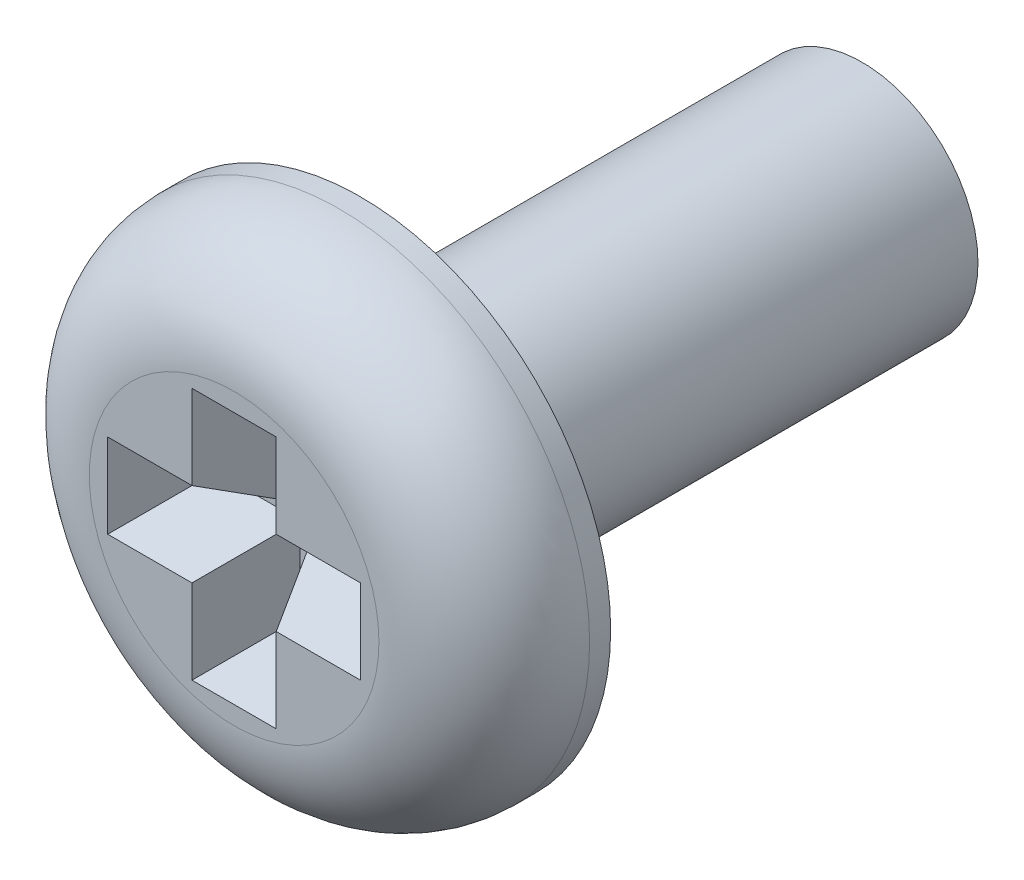
ISO-10303-21;
HEADER;
FILE_DESCRIPTION(('STEP AP214'),'2;1');
FILE_NAME('part.step','',(''),(''),'','','');
FILE_SCHEMA(('AUTOMOTIVE_DESIGN { 1 0 10303 214 1 1 1 1 }'));
ENDSEC;
DATA;
#1=APPLICATION_CONTEXT('core data for automotive mechanical design processes');
#2=APPLICATION_PROTOCOL_DEFINITION('international standard','automotive_design',2000,#1);
#3=PRODUCT_CONTEXT('',#1,'mechanical');
#4=PRODUCT('Part','Part','',(#3));
#5=PRODUCT_RELATED_PRODUCT_CATEGORY('part','',(#4));
#6=PRODUCT_DEFINITION_FORMATION('','',#4);
#7=PRODUCT_DEFINITION_CONTEXT('part definition',#1,'design');
#8=PRODUCT_DEFINITION('design','',#6,#7);
#9=PRODUCT_DEFINITION_SHAPE('','',#8);
#10=(LENGTH_UNIT() NAMED_UNIT(*) SI_UNIT(.MILLI.,.METRE.));
#11=(NAMED_UNIT(*) PLANE_ANGLE_UNIT() SI_UNIT($,.RADIAN.));
#12=(NAMED_UNIT(*) SI_UNIT($,.STERADIAN.) SOLID_ANGLE_UNIT());
#13=UNCERTAINTY_MEASURE_WITH_UNIT(LENGTH_MEASURE(1.E-05),#10,'distance_accuracy_value','');
#14=(GEOMETRIC_REPRESENTATION_CONTEXT(3) GLOBAL_UNCERTAINTY_ASSIGNED_CONTEXT((#13)) GLOBAL_UNIT_ASSIGNED_CONTEXT((#10,
#11,#12)) REPRESENTATION_CONTEXT('',''));
#15=CARTESIAN_POINT('',(0.,0.,0.));
#16=DIRECTION('',(0.,0.,1.));
#17=DIRECTION('',(1.,0.,0.));
#18=AXIS2_PLACEMENT_3D('',#15,#16,#17);
#19=CARTESIAN_POINT('',(0.,0.,0.));
#20=DIRECTION('',(0.,0.,1.));
#21=DIRECTION('',(1.,0.,0.));
#22=AXIS2_PLACEMENT_3D('',#19,#20,#21);
#23=PLANE('',#22);
#24=CARTESIAN_POINT('',(0.,0.,0.));
#25=DIRECTION('',(0.,0.,1.));
#26=DIRECTION('',(1.,0.,0.));
#27=AXIS2_PLACEMENT_3D('',#24,#25,#26);
#28=CIRCLE('',#27,2.375);
#29=CARTESIAN_POINT('',(2.375,0.,0.));
#30=VERTEX_POINT('',#29);
#31=EDGE_CURVE('E174',#30,#30,#28,.T.);
#32=ORIENTED_EDGE('',*,*,#31,.F.);
#33=EDGE_LOOP('',(#32));
#34=FACE_BOUND('',#33,.T.);
#35=CARTESIAN_POINT('',(0.,0.,0.));
#36=DIRECTION('',(0.,0.,1.));
#37=DIRECTION('',(1.,0.,0.));
#38=AXIS2_PLACEMENT_3D('',#35,#36,#37);
#39=CIRCLE('',#38,1.1);
#40=CARTESIAN_POINT('',(1.1,0.,0.));
#41=VERTEX_POINT('',#40);
#42=EDGE_CURVE('E11',#41,#41,#39,.F.);
#43=ORIENTED_EDGE('',*,*,#42,.F.);
#44=EDGE_LOOP('',(#43));
#45=FACE_BOUND('',#44,.T.);
#46=ADVANCED_FACE('F30',(#34,#45),#23,.F.);
#47=CARTESIAN_POINT('',(0.,0.,1.2));
#48=DIRECTION('',(0.,0.,-1.));
#49=DIRECTION('',(-1.,0.,0.));
#50=AXIS2_PLACEMENT_3D('',#47,#48,#49);
#51=CYLINDRICAL_SURFACE('',#50,2.375);
#52=CARTESIAN_POINT('',(0.,0.,0.2));
#53=DIRECTION('',(0.,0.,1.));
#54=DIRECTION('',(1.,0.,0.));
#55=AXIS2_PLACEMENT_3D('',#52,#53,#54);
#56=CIRCLE('',#55,2.375);
#57=CARTESIAN_POINT('',(2.375,0.,0.2));
#58=VERTEX_POINT('',#57);
#59=EDGE_CURVE('E38',#58,#58,#56,.F.);
#60=ORIENTED_EDGE('',*,*,#59,.T.);
#61=EDGE_LOOP('',(#60));
#62=FACE_BOUND('',#61,.T.);
#63=ORIENTED_EDGE('',*,*,#31,.T.);
#64=EDGE_LOOP('',(#63));
#65=FACE_BOUND('',#64,.T.);
#66=ADVANCED_FACE('F32',(#62,#65),#51,.T.);
#67=CARTESIAN_POINT('',(0.,0.,1.2));
#68=DIRECTION('',(0.,0.,1.));
#69=DIRECTION('',(1.,0.,0.));
#70=AXIS2_PLACEMENT_3D('',#67,#68,#69);
#71=PLANE('',#70);
#72=DIRECTION('',(0.,1.,0.));
#73=VECTOR('',#72,1.);
#74=CARTESIAN_POINT('',(1.2,0.4,1.2));
#75=LINE('',#74,#73);
#76=CARTESIAN_POINT('',(1.2,-0.4,1.2));
#77=VERTEX_POINT('',#76);
#78=CARTESIAN_POINT('',(1.2,0.4,1.2));
#79=VERTEX_POINT('',#78);
#80=EDGE_CURVE('E45',#77,#79,#75,.T.);
#81=ORIENTED_EDGE('',*,*,#80,.F.);
#82=DIRECTION('',(1.,0.,0.));
#83=VECTOR('',#82,1.);
#84=CARTESIAN_POINT('',(1.2,-0.4,1.2));
#85=LINE('',#84,#83);
#86=CARTESIAN_POINT('',(0.4,-0.4,1.2));
#87=VERTEX_POINT('',#86);
#88=EDGE_CURVE('E170',#87,#77,#85,.T.);
#89=ORIENTED_EDGE('',*,*,#88,.F.);
#90=DIRECTION('',(0.,1.,0.));
#91=VECTOR('',#90,1.);
#92=CARTESIAN_POINT('',(0.4,-0.4,1.2));
#93=LINE('',#92,#91);
#94=CARTESIAN_POINT('',(0.4,-1.2,1.2));
#95=VERTEX_POINT('',#94);
#96=EDGE_CURVE('E168',#95,#87,#93,.T.);
#97=ORIENTED_EDGE('',*,*,#96,.F.);
#98=DIRECTION('',(1.,0.,0.));
#99=VECTOR('',#98,1.);
#100=CARTESIAN_POINT('',(-0.4,-1.2,1.2));
#101=LINE('',#100,#99);
#102=CARTESIAN_POINT('',(-0.4,-1.2,1.2));
#103=VERTEX_POINT('',#102);
#104=EDGE_CURVE('E165',#103,#95,#101,.T.);
#105=ORIENTED_EDGE('',*,*,#104,.F.);
#106=DIRECTION('',(0.,-1.,0.));
#107=VECTOR('',#106,1.);
#108=CARTESIAN_POINT('',(-0.4,-0.4,1.2));
#109=LINE('',#108,#107);
#110=CARTESIAN_POINT('',(-0.4,-0.4,1.2));
#111=VERTEX_POINT('',#110);
#112=EDGE_CURVE('E162',#111,#103,#109,.T.);
#113=ORIENTED_EDGE('',*,*,#112,.F.);
#114=DIRECTION('',(1.,0.,0.));
#115=VECTOR('',#114,1.);
#116=CARTESIAN_POINT('',(-0.4,-0.4,1.2));
#117=LINE('',#116,#115);
#118=CARTESIAN_POINT('',(-1.2,-0.4,1.2));
#119=VERTEX_POINT('',#118);
#120=EDGE_CURVE('E159',#119,#111,#117,.T.);
#121=ORIENTED_EDGE('',*,*,#120,.F.);
#122=DIRECTION('',(0.,-1.,0.));
#123=VECTOR('',#122,1.);
#124=CARTESIAN_POINT('',(-1.2,0.4,1.2));
#125=LINE('',#124,#123);
#126=CARTESIAN_POINT('',(-1.2,0.4,1.2));
#127=VERTEX_POINT('',#126);
#128=EDGE_CURVE('E156',#127,#119,#125,.T.);
#129=ORIENTED_EDGE('',*,*,#128,.F.);
#130=DIRECTION('',(-1.,0.,0.));
#131=VECTOR('',#130,1.);
#132=CARTESIAN_POINT('',(-0.4,0.4,1.2));
#133=LINE('',#132,#131);
#134=CARTESIAN_POINT('',(-0.4,0.4,1.2));
#135=VERTEX_POINT('',#134);
#136=EDGE_CURVE('E153',#135,#127,#133,.T.);
#137=ORIENTED_EDGE('',*,*,#136,.F.);
#138=DIRECTION('',(0.,-1.,0.));
#139=VECTOR('',#138,1.);
#140=CARTESIAN_POINT('',(-0.4,1.2,1.2));
#141=LINE('',#140,#139);
#142=CARTESIAN_POINT('',(-0.4,1.2,1.2));
#143=VERTEX_POINT('',#142);
#144=EDGE_CURVE('E147',#143,#135,#141,.T.);
#145=ORIENTED_EDGE('',*,*,#144,.F.);
#146=DIRECTION('',(-1.,0.,0.));
#147=VECTOR('',#146,1.);
#148=CARTESIAN_POINT('',(-0.4,1.2,1.2));
#149=LINE('',#148,#147);
#150=CARTESIAN_POINT('',(0.4,1.2,1.2));
#151=VERTEX_POINT('',#150);
#152=EDGE_CURVE('E145',#151,#143,#149,.T.);
#153=ORIENTED_EDGE('',*,*,#152,.F.);
#154=DIRECTION('',(0.,1.,0.));
#155=VECTOR('',#154,1.);
#156=CARTESIAN_POINT('',(0.4,1.2,1.2));
#157=LINE('',#156,#155);
#158=CARTESIAN_POINT('',(0.4,0.4,1.2));
#159=VERTEX_POINT('',#158);
#160=EDGE_CURVE('E128',#159,#151,#157,.T.);
#161=ORIENTED_EDGE('',*,*,#160,.F.);
#162=DIRECTION('',(-1.,0.,0.));
#163=VECTOR('',#162,1.);
#164=CARTESIAN_POINT('',(1.2,0.4,1.2));
#165=LINE('',#164,#163);
#166=EDGE_CURVE('E137',#79,#159,#165,.T.);
#167=ORIENTED_EDGE('',*,*,#166,.F.);
#168=EDGE_LOOP('',(#81,#89,#97,#105,#113,#121,#129,#137,#145,#153,#161,#167));
#169=FACE_BOUND('',#168,.T.);
#170=CARTESIAN_POINT('',(0.,0.,1.2));
#171=DIRECTION('',(0.,0.,1.));
#172=DIRECTION('',(1.,0.,0.));
#173=AXIS2_PLACEMENT_3D('',#170,#171,#172);
#174=CIRCLE('',#173,1.375);
#175=CARTESIAN_POINT('',(1.375,0.,1.2));
#176=VERTEX_POINT('',#175);
#177=EDGE_CURVE('E226',#176,#176,#174,.T.);
#178=ORIENTED_EDGE('',*,*,#177,.T.);
#179=EDGE_LOOP('',(#178));
#180=FACE_BOUND('',#179,.T.);
#181=ADVANCED_FACE('F141',(#169,#180),#71,.T.);
#182=CARTESIAN_POINT('',(0.,0.,0.2));
#183=DIRECTION('',(0.,0.,1.));
#184=DIRECTION('',(1.,0.,0.));
#185=AXIS2_PLACEMENT_3D('',#182,#183,#184);
#186=TOROIDAL_SURFACE('',#185,1.375,1.);
#187=ORIENTED_EDGE('',*,*,#59,.F.);
#188=EDGE_LOOP('',(#187));
#189=FACE_BOUND('',#188,.T.);
#190=ORIENTED_EDGE('',*,*,#177,.F.);
#191=EDGE_LOOP('',(#190));
#192=FACE_BOUND('',#191,.T.);
#193=ADVANCED_FACE('F233',(#189,#192),#186,.T.);
#194=CARTESIAN_POINT('',(1.2,0.4,1.2));
#195=DIRECTION('',(0.906307787036649,0.,-0.4226182617407));
#196=DIRECTION('',(-0.4226182617407,0.,-0.90630778703665));
#197=AXIS2_PLACEMENT_3D('',#194,#195,#196);
#198=PLANE('',#197);
#199=ORIENTED_EDGE('',*,*,#80,.T.);
#200=DIRECTION('',(0.389281620635026,0.389281620635026,0.834817129478987));
#201=VECTOR('',#200,1.);
#202=CARTESIAN_POINT('',(1.2,0.4,1.2));
#203=LINE('',#202,#201);
#204=CARTESIAN_POINT('',(0.8735846392915,0.0735846392915003,0.5));
#205=VERTEX_POINT('',#204);
#206=EDGE_CURVE('E88',#205,#79,#203,.T.);
#207=ORIENTED_EDGE('',*,*,#206,.F.);
#208=DIRECTION('',(0.,1.,0.));
#209=VECTOR('',#208,1.);
#210=CARTESIAN_POINT('',(0.8735846392915,-1.2,0.5));
#211=LINE('',#210,#209);
#212=CARTESIAN_POINT('',(0.8735846392915,-0.0735846392915001,0.5));
#213=VERTEX_POINT('',#212);
#214=EDGE_CURVE('E172',#213,#205,#211,.T.);
#215=ORIENTED_EDGE('',*,*,#214,.F.);
#216=DIRECTION('',(0.389281620635026,-0.389281620635026,0.834817129478987));
#217=VECTOR('',#216,1.);
#218=CARTESIAN_POINT('',(1.2,-0.4,1.2));
#219=LINE('',#218,#217);
#220=EDGE_CURVE('E53',#213,#77,#219,.T.);
#221=ORIENTED_EDGE('',*,*,#220,.T.);
#222=EDGE_LOOP('',(#199,#207,#215,#221));
#223=FACE_BOUND('',#222,.T.);
#224=ADVANCED_FACE('F236',(#223),#198,.F.);
#225=CARTESIAN_POINT('',(1.2,-0.4,1.2));
#226=DIRECTION('',(0.,-0.906307787036649,-0.4226182617407));
#227=DIRECTION('',(0.,0.4226182617407,-0.90630778703665));
#228=AXIS2_PLACEMENT_3D('',#225,#226,#227);
#229=PLANE('',#228);
#230=ORIENTED_EDGE('',*,*,#88,.T.);
#231=ORIENTED_EDGE('',*,*,#220,.F.);
#232=DIRECTION('',(1.,0.,0.));
#233=VECTOR('',#232,1.);
#234=CARTESIAN_POINT('',(1.2,-0.0735846392915002,0.5));
#235=LINE('',#234,#233);
#236=CARTESIAN_POINT('',(0.0735846392915001,-0.0735846392915002,0.5));
#237=VERTEX_POINT('',#236);
#238=EDGE_CURVE('E175',#237,#213,#235,.T.);
#239=ORIENTED_EDGE('',*,*,#238,.F.);
#240=DIRECTION('',(0.389281620635026,-0.389281620635026,0.834817129478987));
#241=VECTOR('',#240,1.);
#242=CARTESIAN_POINT('',(0.521232144131386,-0.521232144131386,1.45998317207797));
#243=LINE('',#242,#241);
#244=EDGE_CURVE('E93',#237,#87,#243,.T.);
#245=ORIENTED_EDGE('',*,*,#244,.T.);
#246=EDGE_LOOP('',(#230,#231,#239,#245));
#247=FACE_BOUND('',#246,.T.);
#248=ADVANCED_FACE('F251',(#247),#229,.F.);
#249=CARTESIAN_POINT('',(0.4,-0.4,1.2));
#250=DIRECTION('',(0.906307787036649,0.,-0.4226182617407));
#251=DIRECTION('',(-0.4226182617407,0.,-0.90630778703665));
#252=AXIS2_PLACEMENT_3D('',#249,#250,#251);
#253=PLANE('',#252);
#254=ORIENTED_EDGE('',*,*,#96,.T.);
#255=ORIENTED_EDGE('',*,*,#244,.F.);
#256=DIRECTION('',(0.,1.,0.));
#257=VECTOR('',#256,1.);
#258=CARTESIAN_POINT('',(0.0735846392915004,-1.2,0.5));
#259=LINE('',#258,#257);
#260=CARTESIAN_POINT('',(0.0735846392915003,-0.8735846392915,0.5));
#261=VERTEX_POINT('',#260);
#262=EDGE_CURVE('E198',#261,#237,#259,.T.);
#263=ORIENTED_EDGE('',*,*,#262,.F.);
#264=DIRECTION('',(0.389281620635026,-0.389281620635026,0.834817129478987));
#265=VECTOR('',#264,1.);
#266=CARTESIAN_POINT('',(0.278767855868615,-1.07876785586861,0.940016827922032));
#267=LINE('',#266,#265);
#268=EDGE_CURVE('E190',#261,#95,#267,.T.);
#269=ORIENTED_EDGE('',*,*,#268,.T.);
#270=EDGE_LOOP('',(#254,#255,#263,#269));
#271=FACE_BOUND('',#270,.T.);
#272=ADVANCED_FACE('F254',(#271),#253,.F.);
#273=CARTESIAN_POINT('',(-0.4,-1.2,1.2));
#274=DIRECTION('',(0.,-0.90630778703665,-0.4226182617407));
#275=DIRECTION('',(0.,0.4226182617407,-0.90630778703665));
#276=AXIS2_PLACEMENT_3D('',#273,#274,#275);
#277=PLANE('',#276);
#278=ORIENTED_EDGE('',*,*,#104,.T.);
#279=ORIENTED_EDGE('',*,*,#268,.F.);
#280=DIRECTION('',(1.,0.,0.));
#281=VECTOR('',#280,1.);
#282=CARTESIAN_POINT('',(1.2,-0.8735846392915,0.5));
#283=LINE('',#282,#281);
#284=CARTESIAN_POINT('',(-0.0735846392915001,-0.8735846392915,0.5));
#285=VERTEX_POINT('',#284);
#286=EDGE_CURVE('E201',#285,#261,#283,.T.);
#287=ORIENTED_EDGE('',*,*,#286,.F.);
#288=DIRECTION('',(-0.389281620635026,-0.389281620635026,0.834817129478987));
#289=VECTOR('',#288,1.);
#290=CARTESIAN_POINT('',(-0.278767855868614,-1.07876785586861,0.940016827922032));
#291=LINE('',#290,#289);
#292=EDGE_CURVE('E188',#285,#103,#291,.T.);
#293=ORIENTED_EDGE('',*,*,#292,.T.);
#294=EDGE_LOOP('',(#278,#279,#287,#293));
#295=FACE_BOUND('',#294,.T.);
#296=ADVANCED_FACE('F257',(#295),#277,.F.);
#297=CARTESIAN_POINT('',(-0.4,-0.4,1.2));
#298=DIRECTION('',(-0.906307787036649,0.,-0.4226182617407));
#299=DIRECTION('',(-0.4226182617407,0.,0.90630778703665));
#300=AXIS2_PLACEMENT_3D('',#297,#298,#299);
#301=PLANE('',#300);
#302=ORIENTED_EDGE('',*,*,#112,.T.);
#303=ORIENTED_EDGE('',*,*,#292,.F.);
#304=DIRECTION('',(0.,-1.,0.));
#305=VECTOR('',#304,1.);
#306=CARTESIAN_POINT('',(-0.0735846392915002,-1.2,0.5));
#307=LINE('',#306,#305);
#308=CARTESIAN_POINT('',(-0.0735846392915002,-0.0735846392915001,0.5));
#309=VERTEX_POINT('',#308);
#310=EDGE_CURVE('E204',#309,#285,#307,.T.);
#311=ORIENTED_EDGE('',*,*,#310,.F.);
#312=DIRECTION('',(-0.389281620635026,-0.389281620635026,0.834817129478987));
#313=VECTOR('',#312,1.);
#314=CARTESIAN_POINT('',(-0.4,-0.4,1.2));
#315=LINE('',#314,#313);
#316=EDGE_CURVE('E186',#309,#111,#315,.T.);
#317=ORIENTED_EDGE('',*,*,#316,.T.);
#318=EDGE_LOOP('',(#302,#303,#311,#317));
#319=FACE_BOUND('',#318,.T.);
#320=ADVANCED_FACE('F261',(#319),#301,.F.);
#321=CARTESIAN_POINT('',(-0.4,-0.4,1.2));
#322=DIRECTION('',(0.,-0.90630778703665,-0.4226182617407));
#323=DIRECTION('',(0.,0.4226182617407,-0.90630778703665));
#324=AXIS2_PLACEMENT_3D('',#321,#322,#323);
#325=PLANE('',#324);
#326=ORIENTED_EDGE('',*,*,#120,.T.);
#327=ORIENTED_EDGE('',*,*,#316,.F.);
#328=DIRECTION('',(1.,0.,0.));
#329=VECTOR('',#328,1.);
#330=CARTESIAN_POINT('',(1.2,-0.0735846392914997,0.5));
#331=LINE('',#330,#329);
#332=CARTESIAN_POINT('',(-0.8735846392915,-0.0735846392915003,0.5));
#333=VERTEX_POINT('',#332);
#334=EDGE_CURVE('E207',#333,#309,#331,.T.);
#335=ORIENTED_EDGE('',*,*,#334,.F.);
#336=DIRECTION('',(-0.389281620635026,-0.389281620635026,0.834817129478987));
#337=VECTOR('',#336,1.);
#338=CARTESIAN_POINT('',(-1.07876785586861,-0.278767855868615,0.940016827922032));
#339=LINE('',#338,#337);
#340=EDGE_CURVE('E184',#333,#119,#339,.T.);
#341=ORIENTED_EDGE('',*,*,#340,.T.);
#342=EDGE_LOOP('',(#326,#327,#335,#341));
#343=FACE_BOUND('',#342,.T.);
#344=ADVANCED_FACE('F265',(#343),#325,.F.);
#345=CARTESIAN_POINT('',(-1.2,0.4,1.2));
#346=DIRECTION('',(-0.90630778703665,0.,-0.4226182617407));
#347=DIRECTION('',(-0.4226182617407,0.,0.90630778703665));
#348=AXIS2_PLACEMENT_3D('',#345,#346,#347);
#349=PLANE('',#348);
#350=ORIENTED_EDGE('',*,*,#128,.T.);
#351=ORIENTED_EDGE('',*,*,#340,.F.);
#352=DIRECTION('',(0.,-1.,0.));
#353=VECTOR('',#352,1.);
#354=CARTESIAN_POINT('',(-0.8735846392915,-1.2,0.5));
#355=LINE('',#354,#353);
#356=CARTESIAN_POINT('',(-0.8735846392915,0.0735846392915001,0.5));
#357=VERTEX_POINT('',#356);
#358=EDGE_CURVE('E210',#357,#333,#355,.T.);
#359=ORIENTED_EDGE('',*,*,#358,.F.);
#360=DIRECTION('',(-0.389281620635026,0.389281620635026,0.834817129478987));
#361=VECTOR('',#360,1.);
#362=CARTESIAN_POINT('',(-1.07876785586861,0.278767855868614,0.940016827922032));
#363=LINE('',#362,#361);
#364=EDGE_CURVE('E182',#357,#127,#363,.T.);
#365=ORIENTED_EDGE('',*,*,#364,.T.);
#366=EDGE_LOOP('',(#350,#351,#359,#365));
#367=FACE_BOUND('',#366,.T.);
#368=ADVANCED_FACE('F269',(#367),#349,.F.);
#369=CARTESIAN_POINT('',(-0.4,0.4,1.2));
#370=DIRECTION('',(0.,0.90630778703665,-0.4226182617407));
#371=DIRECTION('',(0.,0.4226182617407,0.90630778703665));
#372=AXIS2_PLACEMENT_3D('',#369,#370,#371);
#373=PLANE('',#372);
#374=ORIENTED_EDGE('',*,*,#136,.T.);
#375=ORIENTED_EDGE('',*,*,#364,.F.);
#376=DIRECTION('',(-1.,0.,0.));
#377=VECTOR('',#376,1.);
#378=CARTESIAN_POINT('',(1.2,0.0735846392915002,0.5));
#379=LINE('',#378,#377);
#380=CARTESIAN_POINT('',(-0.0735846392915003,0.0735846392915003,0.5));
#381=VERTEX_POINT('',#380);
#382=EDGE_CURVE('E213',#381,#357,#379,.T.);
#383=ORIENTED_EDGE('',*,*,#382,.F.);
#384=DIRECTION('',(-0.389281620635026,0.389281620635026,0.834817129478987));
#385=VECTOR('',#384,1.);
#386=CARTESIAN_POINT('',(-0.4,0.4,1.2));
#387=LINE('',#386,#385);
#388=EDGE_CURVE('E180',#381,#135,#387,.T.);
#389=ORIENTED_EDGE('',*,*,#388,.T.);
#390=EDGE_LOOP('',(#374,#375,#383,#389));
#391=FACE_BOUND('',#390,.T.);
#392=ADVANCED_FACE('F273',(#391),#373,.F.);
#393=CARTESIAN_POINT('',(-0.4,1.2,1.2));
#394=DIRECTION('',(-0.906307787036649,0.,-0.4226182617407));
#395=DIRECTION('',(-0.4226182617407,0.,0.90630778703665));
#396=AXIS2_PLACEMENT_3D('',#393,#394,#395);
#397=PLANE('',#396);
#398=ORIENTED_EDGE('',*,*,#144,.T.);
#399=ORIENTED_EDGE('',*,*,#388,.F.);
#400=DIRECTION('',(0.,-1.,0.));
#401=VECTOR('',#400,1.);
#402=CARTESIAN_POINT('',(-0.0735846392915002,-1.2,0.5));
#403=LINE('',#402,#401);
#404=CARTESIAN_POINT('',(-0.0735846392915003,0.8735846392915,0.5));
#405=VERTEX_POINT('',#404);
#406=EDGE_CURVE('E216',#405,#381,#403,.T.);
#407=ORIENTED_EDGE('',*,*,#406,.F.);
#408=DIRECTION('',(-0.389281620635026,0.389281620635026,0.834817129478987));
#409=VECTOR('',#408,1.);
#410=CARTESIAN_POINT('',(-0.4,1.2,1.2));
#411=LINE('',#410,#409);
#412=EDGE_CURVE('E178',#405,#143,#411,.T.);
#413=ORIENTED_EDGE('',*,*,#412,.T.);
#414=EDGE_LOOP('',(#398,#399,#407,#413));
#415=FACE_BOUND('',#414,.T.);
#416=ADVANCED_FACE('F277',(#415),#397,.F.);
#417=CARTESIAN_POINT('',(-0.4,1.2,1.2));
#418=DIRECTION('',(0.,0.90630778703665,-0.4226182617407));
#419=DIRECTION('',(0.,0.4226182617407,0.90630778703665));
#420=AXIS2_PLACEMENT_3D('',#417,#418,#419);
#421=PLANE('',#420);
#422=ORIENTED_EDGE('',*,*,#152,.T.);
#423=ORIENTED_EDGE('',*,*,#412,.F.);
#424=DIRECTION('',(-1.,0.,0.));
#425=VECTOR('',#424,1.);
#426=CARTESIAN_POINT('',(1.2,0.8735846392915,0.5));
#427=LINE('',#426,#425);
#428=CARTESIAN_POINT('',(0.0735846392915001,0.8735846392915,0.5));
#429=VERTEX_POINT('',#428);
#430=EDGE_CURVE('E219',#429,#405,#427,.T.);
#431=ORIENTED_EDGE('',*,*,#430,.F.);
#432=DIRECTION('',(0.389281620635026,0.389281620635026,0.834817129478987));
#433=VECTOR('',#432,1.);
#434=CARTESIAN_POINT('',(0.4,1.2,1.2));
#435=LINE('',#434,#433);
#436=EDGE_CURVE('E134',#429,#151,#435,.T.);
#437=ORIENTED_EDGE('',*,*,#436,.T.);
#438=EDGE_LOOP('',(#422,#423,#431,#437));
#439=FACE_BOUND('',#438,.T.);
#440=ADVANCED_FACE('F281',(#439),#421,.F.);
#441=CARTESIAN_POINT('',(0.4,1.2,1.2));
#442=DIRECTION('',(0.906307787036649,0.,-0.4226182617407));
#443=DIRECTION('',(-0.4226182617407,0.,-0.90630778703665));
#444=AXIS2_PLACEMENT_3D('',#441,#442,#443);
#445=PLANE('',#444);
#446=ORIENTED_EDGE('',*,*,#160,.T.);
#447=ORIENTED_EDGE('',*,*,#436,.F.);
#448=DIRECTION('',(0.,1.,0.));
#449=VECTOR('',#448,1.);
#450=CARTESIAN_POINT('',(0.0735846392915004,-1.2,0.5));
#451=LINE('',#450,#449);
#452=CARTESIAN_POINT('',(0.0735846392915002,0.0735846392915001,0.5));
#453=VERTEX_POINT('',#452);
#454=EDGE_CURVE('E131',#453,#429,#451,.T.);
#455=ORIENTED_EDGE('',*,*,#454,.F.);
#456=DIRECTION('',(0.389281620635026,0.389281620635026,0.834817129478987));
#457=VECTOR('',#456,1.);
#458=CARTESIAN_POINT('',(0.521232144131386,0.521232144131386,1.45998317207797));
#459=LINE('',#458,#457);
#460=EDGE_CURVE('E124',#453,#159,#459,.T.);
#461=ORIENTED_EDGE('',*,*,#460,.T.);
#462=EDGE_LOOP('',(#446,#447,#455,#461));
#463=FACE_BOUND('',#462,.T.);
#464=ADVANCED_FACE('F126',(#463),#445,.F.);
#465=CARTESIAN_POINT('',(1.2,0.4,1.2));
#466=DIRECTION('',(0.,0.906307787036649,-0.4226182617407));
#467=DIRECTION('',(0.,0.4226182617407,0.90630778703665));
#468=AXIS2_PLACEMENT_3D('',#465,#466,#467);
#469=PLANE('',#468);
#470=ORIENTED_EDGE('',*,*,#166,.T.);
#471=ORIENTED_EDGE('',*,*,#460,.F.);
#472=DIRECTION('',(-1.,0.,0.));
#473=VECTOR('',#472,1.);
#474=CARTESIAN_POINT('',(1.2,0.0735846392915004,0.5));
#475=LINE('',#474,#473);
#476=EDGE_CURVE('E195',#205,#453,#475,.T.);
#477=ORIENTED_EDGE('',*,*,#476,.F.);
#478=ORIENTED_EDGE('',*,*,#206,.T.);
#479=EDGE_LOOP('',(#470,#471,#477,#478));
#480=FACE_BOUND('',#479,.T.);
#481=ADVANCED_FACE('F138',(#480),#469,.F.);
#482=CARTESIAN_POINT('',(1.2,-1.2,0.5));
#483=DIRECTION('',(0.,0.,1.));
#484=DIRECTION('',(1.,0.,0.));
#485=AXIS2_PLACEMENT_3D('',#482,#483,#484);
#486=PLANE('',#485);
#487=ORIENTED_EDGE('',*,*,#214,.T.);
#488=ORIENTED_EDGE('',*,*,#476,.T.);
#489=ORIENTED_EDGE('',*,*,#454,.T.);
#490=ORIENTED_EDGE('',*,*,#430,.T.);
#491=ORIENTED_EDGE('',*,*,#406,.T.);
#492=ORIENTED_EDGE('',*,*,#382,.T.);
#493=ORIENTED_EDGE('',*,*,#358,.T.);
#494=ORIENTED_EDGE('',*,*,#334,.T.);
#495=ORIENTED_EDGE('',*,*,#310,.T.);
#496=ORIENTED_EDGE('',*,*,#286,.T.);
#497=ORIENTED_EDGE('',*,*,#262,.T.);
#498=ORIENTED_EDGE('',*,*,#238,.T.);
#499=EDGE_LOOP('',(#487,#488,#489,#490,#491,#492,#493,#494,#495,#496,#497,#498));
#500=FACE_BOUND('',#499,.T.);
#501=ADVANCED_FACE('F290',(#500),#486,.T.);
#502=CARTESIAN_POINT('',(0.,0.,-4.7625));
#503=DIRECTION('',(0.,0.,1.));
#504=DIRECTION('',(1.,0.,0.));
#505=AXIS2_PLACEMENT_3D('',#502,#503,#504);
#506=CYLINDRICAL_SURFACE('',#505,1.1);
#507=CARTESIAN_POINT('',(0.,0.,-4.7625));
#508=DIRECTION('',(0.,0.,-1.));
#509=DIRECTION('',(-1.,0.,0.));
#510=AXIS2_PLACEMENT_3D('',#507,#508,#509);
#511=CIRCLE('',#510,1.1);
#512=CARTESIAN_POINT('',(1.1,0.,-4.7625));
#513=VERTEX_POINT('',#512);
#514=EDGE_CURVE('E307',#513,#513,#511,.T.);
#515=CARTESIAN_POINT('',(1.1,0.,-4.7625));
#516=CARTESIAN_POINT('',(1.1,0.,-4.712890625));
#517=CARTESIAN_POINT('',(1.1,0.,-4.66328125));
#518=CARTESIAN_POINT('',(1.1,0.,-4.5640625));
#519=CARTESIAN_POINT('',(1.1,0.,-4.514453125));
#520=CARTESIAN_POINT('',(1.1,0.,-4.415234375));
#521=CARTESIAN_POINT('',(1.1,0.,-4.365625));
#522=CARTESIAN_POINT('',(1.1,0.,-4.26640625));
#523=CARTESIAN_POINT('',(1.1,0.,-4.216796875));
#524=CARTESIAN_POINT('',(1.1,0.,-4.117578125));
#525=CARTESIAN_POINT('',(1.1,0.,-4.06796875));
#526=CARTESIAN_POINT('',(1.1,0.,-3.96875));
#527=CARTESIAN_POINT('',(1.1,0.,-3.919140625));
#528=CARTESIAN_POINT('',(1.1,0.,-3.819921875));
#529=CARTESIAN_POINT('',(1.1,0.,-3.7703125));
#530=CARTESIAN_POINT('',(1.1,0.,-3.67109375));
#531=CARTESIAN_POINT('',(1.1,0.,-3.621484375));
#532=CARTESIAN_POINT('',(1.1,0.,-3.522265625));
#533=CARTESIAN_POINT('',(1.1,0.,-3.47265625));
#534=CARTESIAN_POINT('',(1.1,0.,-3.3734375));
#535=CARTESIAN_POINT('',(1.1,0.,-3.323828125));
#536=CARTESIAN_POINT('',(1.1,0.,-3.224609375));
#537=CARTESIAN_POINT('',(1.1,0.,-3.175));
#538=CARTESIAN_POINT('',(1.1,0.,-3.07578125));
#539=CARTESIAN_POINT('',(1.1,0.,-3.026171875));
#540=CARTESIAN_POINT('',(1.1,0.,-2.926953125));
#541=CARTESIAN_POINT('',(1.1,0.,-2.87734375));
#542=CARTESIAN_POINT('',(1.1,0.,-2.778125));
#543=CARTESIAN_POINT('',(1.1,0.,-2.728515625));
#544=CARTESIAN_POINT('',(1.1,0.,-2.629296875));
#545=CARTESIAN_POINT('',(1.1,0.,-2.5796875));
#546=CARTESIAN_POINT('',(1.1,0.,-2.48046875));
#547=CARTESIAN_POINT('',(1.1,0.,-2.430859375));
#548=CARTESIAN_POINT('',(1.1,0.,-2.331640625));
#549=CARTESIAN_POINT('',(1.1,0.,-2.28203125));
#550=CARTESIAN_POINT('',(1.1,0.,-2.1828125));
#551=CARTESIAN_POINT('',(1.1,0.,-2.133203125));
#552=CARTESIAN_POINT('',(1.1,0.,-2.033984375));
#553=CARTESIAN_POINT('',(1.1,0.,-1.984375));
#554=CARTESIAN_POINT('',(1.1,0.,-1.88515625));
#555=CARTESIAN_POINT('',(1.1,0.,-1.835546875));
#556=CARTESIAN_POINT('',(1.1,0.,-1.736328125));
#557=CARTESIAN_POINT('',(1.1,0.,-1.68671875));
#558=CARTESIAN_POINT('',(1.1,0.,-1.5875));
#559=CARTESIAN_POINT('',(1.1,0.,-1.537890625));
#560=CARTESIAN_POINT('',(1.1,0.,-1.438671875));
#561=CARTESIAN_POINT('',(1.1,0.,-1.3890625));
#562=CARTESIAN_POINT('',(1.1,0.,-1.28984375));
#563=CARTESIAN_POINT('',(1.1,0.,-1.240234375));
#564=CARTESIAN_POINT('',(1.1,0.,-1.141015625));
#565=CARTESIAN_POINT('',(1.1,0.,-1.09140625));
#566=CARTESIAN_POINT('',(1.1,0.,-0.992187499999999));
#567=CARTESIAN_POINT('',(1.1,0.,-0.942578124999999));
#568=CARTESIAN_POINT('',(1.1,0.,-0.843359375));
#569=CARTESIAN_POINT('',(1.1,0.,-0.79375));
#570=CARTESIAN_POINT('',(1.1,0.,-0.69453125));
#571=CARTESIAN_POINT('',(1.1,0.,-0.644921875));
#572=CARTESIAN_POINT('',(1.1,0.,-0.545703125));
#573=CARTESIAN_POINT('',(1.1,0.,-0.49609375));
#574=CARTESIAN_POINT('',(1.1,0.,-0.396875));
#575=CARTESIAN_POINT('',(1.1,0.,-0.347265625));
#576=CARTESIAN_POINT('',(1.1,0.,-0.248046875));
#577=CARTESIAN_POINT('',(1.1,0.,-0.1984375));
#578=CARTESIAN_POINT('',(1.1,0.,-0.09921875));
#579=CARTESIAN_POINT('',(1.1,0.,-0.049609375));
#580=CARTESIAN_POINT('',(1.1,0.,0.));
#581=B_SPLINE_CURVE_WITH_KNOTS('',3,(#515,#516,#517,#518,#519,#520,#521,#522,#523,#524,#525,
#526,#527,#528,#529,#530,#531,#532,#533,#534,#535,#536,#537,#538,#539,#540,#541,#542,#543,#544,
#545,#546,#547,#548,#549,#550,#551,#552,#553,#554,#555,#556,#557,#558,#559,#560,#561,#562,#563,
#564,#565,#566,#567,#568,#569,#570,#571,#572,#573,#574,#575,#576,#577,#578,#579,#580),
.UNSPECIFIED.,.F.,.F.,(4,2,2,2,2,2,2,2,2,2,2,2,2,2,2,2,2,2,2,2,2,2,2,2,2,2,2,2,2,2,2,2,4),(0.,
0.148828125,0.29765625,0.446484375,0.5953125,0.744140625,0.892968750000001,1.041796875,1.190625,
1.339453125,1.48828125,1.637109375,1.7859375,1.934765625,2.08359375,2.232421875,2.38125,
2.530078125,2.67890625,2.827734375,2.9765625,3.125390625,3.27421875,3.423046875,3.571875,
3.720703125,3.86953125,4.018359375,4.1671875,4.316015625,4.46484375,4.613671875,4.7625),.UNSPECIFIED.);
#582=EDGE_CURVE('BSEAM295',#513,#41,#581,.T.);
#583=ORIENTED_EDGE('',*,*,#514,.F.);
#584=ORIENTED_EDGE('',*,*,#42,.T.);
#585=ORIENTED_EDGE('',*,*,#582,.T.);
#586=ORIENTED_EDGE('',*,*,#582,.F.);
#587=EDGE_LOOP('',(#583,#585,#584,#586));
#588=FACE_BOUND('',#587,.T.);
#589=ADVANCED_FACE('F295',(#588),#506,.T.);
#590=CARTESIAN_POINT('',(0.,0.,-4.7625));
#591=DIRECTION('',(0.,0.,-1.));
#592=DIRECTION('',(-1.,0.,0.));
#593=AXIS2_PLACEMENT_3D('',#590,#591,#592);
#594=PLANE('',#593);
#595=ORIENTED_EDGE('',*,*,#514,.T.);
#596=EDGE_LOOP('',(#595));
#597=FACE_BOUND('',#596,.T.);
#598=ADVANCED_FACE('F299',(#597),#594,.T.);
#599=CLOSED_SHELL('',(#46,#66,#181,#193,#224,#248,#272,#296,#320,#344,#368,#392,#416,#440,#464,
#481,#501,#589,#598));
#600=MANIFOLD_SOLID_BREP('B2',#599);
#601=ADVANCED_BREP_SHAPE_REPRESENTATION('',(#18,#600),#14);
#602=SHAPE_DEFINITION_REPRESENTATION(#9,#601);
ENDSEC;
END-ISO-10303-21;
